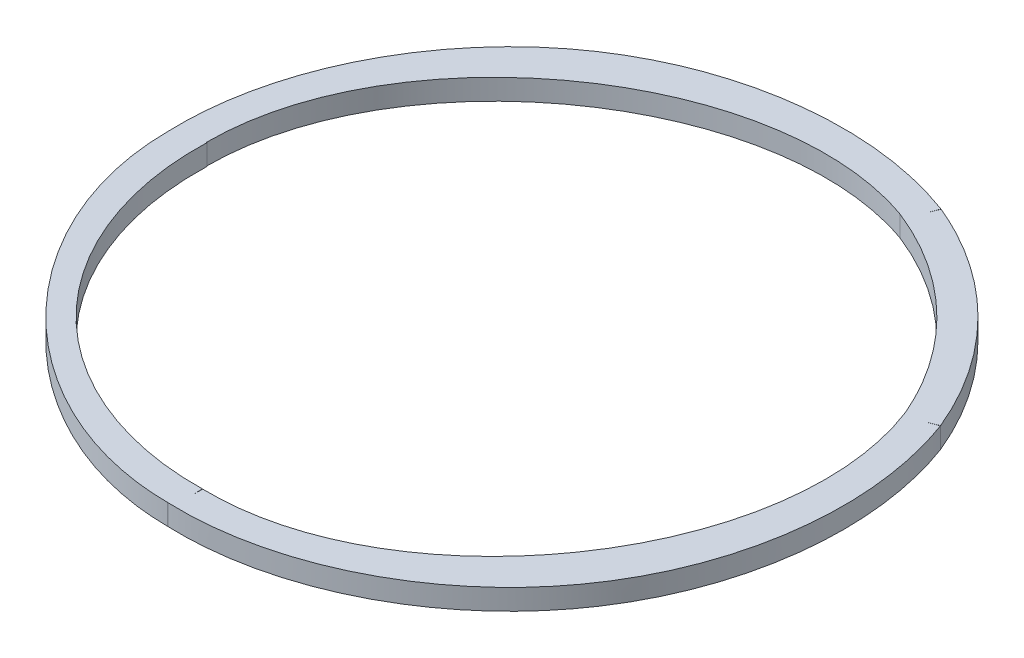
ISO-10303-21;
HEADER;
FILE_DESCRIPTION(('STEP AP214'),'2;1');
FILE_NAME('part.step','',(''),(''),'','','');
FILE_SCHEMA(('AUTOMOTIVE_DESIGN { 1 0 10303 214 1 1 1 1 }'));
ENDSEC;
DATA;
#1=APPLICATION_CONTEXT('core data for automotive mechanical design processes');
#2=APPLICATION_PROTOCOL_DEFINITION('international standard','automotive_design',2000,#1);
#3=PRODUCT_CONTEXT('',#1,'mechanical');
#4=PRODUCT('Part','Part','',(#3));
#5=PRODUCT_RELATED_PRODUCT_CATEGORY('part','',(#4));
#6=PRODUCT_DEFINITION_FORMATION('','',#4);
#7=PRODUCT_DEFINITION_CONTEXT('part definition',#1,'design');
#8=PRODUCT_DEFINITION('design','',#6,#7);
#9=PRODUCT_DEFINITION_SHAPE('','',#8);
#10=(LENGTH_UNIT() NAMED_UNIT(*) SI_UNIT(.MILLI.,.METRE.));
#11=(NAMED_UNIT(*) PLANE_ANGLE_UNIT() SI_UNIT($,.RADIAN.));
#12=(NAMED_UNIT(*) SI_UNIT($,.STERADIAN.) SOLID_ANGLE_UNIT());
#13=UNCERTAINTY_MEASURE_WITH_UNIT(LENGTH_MEASURE(1.E-05),#10,'distance_accuracy_value','');
#14=(GEOMETRIC_REPRESENTATION_CONTEXT(3) GLOBAL_UNCERTAINTY_ASSIGNED_CONTEXT((#13)) GLOBAL_UNIT_ASSIGNED_CONTEXT((#10,
#11,#12)) REPRESENTATION_CONTEXT('',''));
#15=CARTESIAN_POINT('',(0.,0.,0.));
#16=DIRECTION('',(0.,0.,1.));
#17=DIRECTION('',(1.,0.,0.));
#18=AXIS2_PLACEMENT_3D('',#15,#16,#17);
#19=CARTESIAN_POINT('',(131.74613108293,-4.90687617358795,77.1835281712838));
#20=DIRECTION('',(-0.347055812019883,0.,-0.937844477161976));
#21=DIRECTION('',(-0.937844477161976,0.,0.347055812019883));
#22=AXIS2_PLACEMENT_3D('',#19,#20,#21);
#23=PLANE('',#22);
#24=DIRECTION('',(-0.937844477161976,0.,0.347055812019883));
#25=VECTOR('',#24,1.);
#26=CARTESIAN_POINT('',(131.74613108293,-2.98931512157521,77.1835281712838));
#27=LINE('',#26,#25);
#28=CARTESIAN_POINT('',(132.57891060061,-2.98931512157521,76.8753523715857));
#29=VERTEX_POINT('',#28);
#30=CARTESIAN_POINT('',(131.74613108293,-2.98931512157521,77.1835281712839));
#31=VERTEX_POINT('',#30);
#32=EDGE_CURVE('E345',#29,#31,#27,.T.);
#33=ORIENTED_EDGE('',*,*,#32,.F.);
#34=DIRECTION('',(0.,1.,0.));
#35=VECTOR('',#34,1.);
#36=CARTESIAN_POINT('',(132.57891060061,-4.90687617358795,76.8753523715857));
#37=LINE('',#36,#35);
#38=CARTESIAN_POINT('',(132.57891060061,-4.90687617358795,76.8753523715857));
#39=VERTEX_POINT('',#38);
#40=EDGE_CURVE('E37',#39,#29,#37,.T.);
#41=ORIENTED_EDGE('',*,*,#40,.F.);
#42=DIRECTION('',(-0.937844477161976,0.,0.347055812019883));
#43=VECTOR('',#42,1.);
#44=CARTESIAN_POINT('',(131.74613108293,-4.90687617358795,77.1835281712838));
#45=LINE('',#44,#43);
#46=CARTESIAN_POINT('',(131.74613108293,-4.90687617358795,77.1835281712839));
#47=VERTEX_POINT('',#46);
#48=EDGE_CURVE('E444',#39,#47,#45,.T.);
#49=ORIENTED_EDGE('',*,*,#48,.T.);
#50=DIRECTION('',(0.,1.,0.));
#51=VECTOR('',#50,1.);
#52=CARTESIAN_POINT('',(131.74613108293,-4.90687617358795,77.1835281712839));
#53=LINE('',#52,#51);
#54=EDGE_CURVE('E10',#47,#31,#53,.T.);
#55=ORIENTED_EDGE('',*,*,#54,.T.);
#56=EDGE_LOOP('',(#33,#41,#49,#55));
#57=FACE_BOUND('',#56,.T.);
#58=ADVANCED_FACE('F16',(#57),#23,.T.);
#59=CARTESIAN_POINT('',(132.567421969439,-4.90687617358795,76.8459258485361));
#60=DIRECTION('',(0.380194838062493,0.,0.924906419650461));
#61=DIRECTION('',(0.924906419650461,0.,-0.380194838062493));
#62=AXIS2_PLACEMENT_3D('',#59,#60,#61);
#63=PLANE('',#62);
#64=DIRECTION('',(0.924906419650461,0.,-0.380194838062493));
#65=VECTOR('',#64,1.);
#66=CARTESIAN_POINT('',(132.567421969439,-2.98931512157521,76.8459258485361));
#67=LINE('',#66,#65);
#68=CARTESIAN_POINT('',(132.567421969439,-2.98931512157521,76.8459258485361));
#69=VERTEX_POINT('',#68);
#70=EDGE_CURVE('E339',#31,#69,#67,.T.);
#71=ORIENTED_EDGE('',*,*,#70,.F.);
#72=ORIENTED_EDGE('',*,*,#54,.F.);
#73=DIRECTION('',(0.924906419650461,0.,-0.380194838062493));
#74=VECTOR('',#73,1.);
#75=CARTESIAN_POINT('',(132.567421969439,-4.90687617358795,76.8459258485361));
#76=LINE('',#75,#74);
#77=CARTESIAN_POINT('',(132.567421969439,-4.90687617358795,76.8459258485361));
#78=VERTEX_POINT('',#77);
#79=EDGE_CURVE('E505',#47,#78,#76,.T.);
#80=ORIENTED_EDGE('',*,*,#79,.T.);
#81=DIRECTION('',(0.,1.,0.));
#82=VECTOR('',#81,1.);
#83=CARTESIAN_POINT('',(132.567421969439,-4.90687617358795,76.8459258485361));
#84=LINE('',#83,#82);
#85=EDGE_CURVE('E28',#78,#69,#84,.T.);
#86=ORIENTED_EDGE('',*,*,#85,.T.);
#87=EDGE_LOOP('',(#71,#72,#80,#86));
#88=FACE_BOUND('',#87,.T.);
#89=ADVANCED_FACE('F487',(#88),#63,.T.);
#90=CARTESIAN_POINT('',(132.567421969439,-4.90687617358795,76.8459258485361));
#91=CARTESIAN_POINT('',(129.354522332708,-4.90687617358795,69.0298505045138));
#92=CARTESIAN_POINT('',(123.053114773261,-4.90687617358794,62.708370783172));
#93=CARTESIAN_POINT('',(115.246623995575,-4.90687617358796,59.4707913904024));
#94=B_SPLINE_CURVE_WITH_KNOTS('',3,(#90,#91,#92,#93),.UNSPECIFIED.,.F.,.F.,(4,4),(0.,1.),.UNSPECIFIED.);
#95=DIRECTION('',(0.,1.,0.));
#96=VECTOR('',#95,1.);
#97=SURFACE_OF_LINEAR_EXTRUSION('',#94,#96);
#98=CARTESIAN_POINT('',(132.567421969439,-2.98931512157521,76.8459258485361));
#99=CARTESIAN_POINT('',(129.354522332708,-2.98931512157521,69.0298505045138));
#100=CARTESIAN_POINT('',(123.053114773261,-2.9893151215752,62.708370783172));
#101=CARTESIAN_POINT('',(115.246623995575,-2.98931512157521,59.4707913904024));
#102=B_SPLINE_CURVE_WITH_KNOTS('',3,(#98,#99,#100,#101),.UNSPECIFIED.,.F.,.F.,(4,4),(0.,1.),.UNSPECIFIED.);
#103=CARTESIAN_POINT('',(115.246623995575,-2.98931512157521,59.4707913904024));
#104=VERTEX_POINT('',#103);
#105=EDGE_CURVE('E334',#69,#104,#102,.T.);
#106=ORIENTED_EDGE('',*,*,#105,.F.);
#107=ORIENTED_EDGE('',*,*,#85,.F.);
#108=CARTESIAN_POINT('',(115.246623995575,-4.90687617358795,59.4707913904024));
#109=VERTEX_POINT('',#108);
#110=EDGE_CURVE('E508',#78,#109,#94,.T.);
#111=ORIENTED_EDGE('',*,*,#110,.T.);
#112=DIRECTION('',(0.,1.,0.));
#113=VECTOR('',#112,1.);
#114=CARTESIAN_POINT('',(115.246623995575,-4.90687617358795,59.4707913904024));
#115=LINE('',#114,#113);
#116=EDGE_CURVE('E268',#109,#104,#115,.T.);
#117=ORIENTED_EDGE('',*,*,#116,.T.);
#118=EDGE_LOOP('',(#106,#107,#111,#117));
#119=FACE_BOUND('',#118,.T.);
#120=ADVANCED_FACE('F492',(#119),#97,.T.);
#121=CARTESIAN_POINT('',(114.906450926429,-4.90687617358796,60.2910208288004));
#122=DIRECTION('',(-0.923711057340234,0.,-0.383089914442272));
#123=DIRECTION('',(-0.383089914442272,0.,0.923711057340234));
#124=AXIS2_PLACEMENT_3D('',#121,#122,#123);
#125=PLANE('',#124);
#126=DIRECTION('',(-0.383089914442271,0.,0.923711057340234));
#127=VECTOR('',#126,1.);
#128=CARTESIAN_POINT('',(114.906450926429,-2.98931512157521,60.2910208288004));
#129=LINE('',#128,#127);
#130=CARTESIAN_POINT('',(114.906450926429,-2.98931512157521,60.2910208288004));
#131=VERTEX_POINT('',#130);
#132=EDGE_CURVE('E331',#104,#131,#129,.T.);
#133=ORIENTED_EDGE('',*,*,#132,.F.);
#134=ORIENTED_EDGE('',*,*,#116,.F.);
#135=DIRECTION('',(-0.383089914442271,0.,0.923711057340234));
#136=VECTOR('',#135,1.);
#137=CARTESIAN_POINT('',(114.906450926429,-4.90687617358796,60.2910208288004));
#138=LINE('',#137,#136);
#139=CARTESIAN_POINT('',(114.906450926429,-4.90687617358795,60.2910208288004));
#140=VERTEX_POINT('',#139);
#141=EDGE_CURVE('E514',#109,#140,#138,.T.);
#142=ORIENTED_EDGE('',*,*,#141,.T.);
#143=DIRECTION('',(0.,1.,0.));
#144=VECTOR('',#143,1.);
#145=CARTESIAN_POINT('',(114.906450926429,-4.90687617358795,60.2910208288004));
#146=LINE('',#145,#144);
#147=EDGE_CURVE('E270',#140,#131,#146,.T.);
#148=ORIENTED_EDGE('',*,*,#147,.T.);
#149=EDGE_LOOP('',(#133,#134,#142,#148));
#150=FACE_BOUND('',#149,.T.);
#151=ADVANCED_FACE('F521',(#150),#125,.T.);
#152=CARTESIAN_POINT('',(115.217245685027,-4.90687617358796,59.4592151624247));
#153=DIRECTION('',(0.936747763028618,0.,0.350005183477161));
#154=DIRECTION('',(0.350005183477161,0.,-0.936747763028618));
#155=AXIS2_PLACEMENT_3D('',#152,#153,#154);
#156=PLANE('',#155);
#157=DIRECTION('',(0.350005183477161,0.,-0.936747763028617));
#158=VECTOR('',#157,1.);
#159=CARTESIAN_POINT('',(115.217245685027,-2.98931512157521,59.4592151624247));
#160=LINE('',#159,#158);
#161=CARTESIAN_POINT('',(115.217245685027,-2.98931512157521,59.4592151624247));
#162=VERTEX_POINT('',#161);
#163=EDGE_CURVE('E328',#131,#162,#160,.T.);
#164=ORIENTED_EDGE('',*,*,#163,.F.);
#165=ORIENTED_EDGE('',*,*,#147,.F.);
#166=DIRECTION('',(0.350005183477161,0.,-0.936747763028617));
#167=VECTOR('',#166,1.);
#168=CARTESIAN_POINT('',(115.217245685027,-4.90687617358796,59.4592151624247));
#169=LINE('',#168,#167);
#170=CARTESIAN_POINT('',(115.217245685027,-4.90687617358795,59.4592151624247));
#171=VERTEX_POINT('',#170);
#172=EDGE_CURVE('E637',#140,#171,#169,.T.);
#173=ORIENTED_EDGE('',*,*,#172,.T.);
#174=DIRECTION('',(0.,1.,0.));
#175=VECTOR('',#174,1.);
#176=CARTESIAN_POINT('',(115.217245685027,-4.90687617358795,59.4592151624247));
#177=LINE('',#176,#175);
#178=EDGE_CURVE('E272',#171,#162,#177,.T.);
#179=ORIENTED_EDGE('',*,*,#178,.T.);
#180=EDGE_LOOP('',(#164,#165,#173,#179));
#181=FACE_BOUND('',#180,.T.);
#182=ADVANCED_FACE('F525',(#181),#156,.T.);
#183=CARTESIAN_POINT('',(115.217245685027,-4.90687617358796,59.4592151624247));
#184=CARTESIAN_POINT('',(105.681355024891,-4.90687617358796,55.8962377080369));
#185=CARTESIAN_POINT('',(94.5520967245877,-4.90687617358796,57.2719692969751));
#186=CARTESIAN_POINT('',(78.0335164211189,-4.90687617358795,68.7285782238615));
#187=CARTESIAN_POINT('',(72.8340523476976,-4.90687617358795,78.7905740329447));
#188=CARTESIAN_POINT('',(73.1976504384416,-4.90687617358796,88.9851735999077));
#189=B_SPLINE_CURVE_WITH_KNOTS('',3,(#183,#184,#185,#186,#187,#188),.UNSPECIFIED.,.F.,.F.,(4,2,
4),(0.,0.5,1.),.UNSPECIFIED.);
#190=DIRECTION('',(0.,1.,0.));
#191=VECTOR('',#190,1.);
#192=SURFACE_OF_LINEAR_EXTRUSION('',#189,#191);
#193=CARTESIAN_POINT('',(115.217245685027,-2.98931512157521,59.4592151624247));
#194=CARTESIAN_POINT('',(105.681355024891,-2.98931512157522,55.8962377080369));
#195=CARTESIAN_POINT('',(94.5520967245877,-2.98931512157522,57.2719692969751));
#196=CARTESIAN_POINT('',(78.0335164211189,-2.98931512157521,68.7285782238615));
#197=CARTESIAN_POINT('',(72.8340523476976,-2.98931512157521,78.7905740329447));
#198=CARTESIAN_POINT('',(73.1976504384416,-2.98931512157521,88.9851735999077));
#199=B_SPLINE_CURVE_WITH_KNOTS('',3,(#193,#194,#195,#196,#197,#198),.UNSPECIFIED.,.F.,.F.,(4,2,
4),(0.,0.5,1.),.UNSPECIFIED.);
#200=CARTESIAN_POINT('',(73.1967187214954,-2.98931512157521,88.9527180602785));
#201=VERTEX_POINT('',#200);
#202=EDGE_CURVE('E318',#162,#201,#199,.T.);
#203=ORIENTED_EDGE('',*,*,#202,.F.);
#204=ORIENTED_EDGE('',*,*,#178,.F.);
#205=CARTESIAN_POINT('',(73.1967187214954,-4.90687617358796,88.9527180602785));
#206=VERTEX_POINT('',#205);
#207=EDGE_CURVE('E543',#171,#206,#189,.T.);
#208=ORIENTED_EDGE('',*,*,#207,.T.);
#209=CARTESIAN_POINT('',(73.1965119092439,-4.90687617358796,88.9527251971773));
#210=DIRECTION('',(0.,1.,0.));
#211=VECTOR('',#210,1.);
#212=LINE('',#209,#211);
#213=EDGE_CURVE('E274',#206,#201,#212,.T.);
#214=ORIENTED_EDGE('',*,*,#213,.T.);
#215=EDGE_LOOP('',(#203,#204,#208,#214));
#216=FACE_BOUND('',#215,.T.);
#217=ADVANCED_FACE('F528',(#216),#192,.T.);
#218=CARTESIAN_POINT('',(73.1970864928779,-4.90687617358795,88.9528098957694));
#219=DIRECTION('',(-0.99999967705338,0.,-0.000803674770162937));
#220=DIRECTION('',(-0.000803674770162937,0.,0.99999967705338));
#221=AXIS2_PLACEMENT_3D('',#218,#219,#220);
#222=PLANE('',#221);
#223=CARTESIAN_POINT('',(73.1970864928779,-2.98931512157521,88.9528098957694));
#224=CARTESIAN_POINT('',(73.1970740422201,-2.98931512157521,88.9683020503149));
#225=CARTESIAN_POINT('',(73.1970615915623,-2.98931512157521,88.9837942048609));
#226=CARTESIAN_POINT('',(73.1970491409046,-2.98931512157521,88.9992863594075));
#227=B_SPLINE_CURVE_WITH_KNOTS('',3,(#223,#224,#225,#226),.UNSPECIFIED.,.F.,.F.,(4,4),(0.,1.),.UNSPECIFIED.);
#228=CARTESIAN_POINT('',(73.1970735882525,-2.98931512157521,88.9688669149515));
#229=VERTEX_POINT('',#228);
#230=EDGE_CURVE('E311',#201,#229,#227,.T.);
#231=ORIENTED_EDGE('',*,*,#230,.F.);
#232=ORIENTED_EDGE('',*,*,#213,.F.);
#233=CARTESIAN_POINT('',(73.1970864928779,-4.90687617358795,88.9528098957694));
#234=CARTESIAN_POINT('',(73.1970740422201,-4.90687617358795,88.9683020503149));
#235=CARTESIAN_POINT('',(73.1970615915623,-4.90687617358795,88.9837942048609));
#236=CARTESIAN_POINT('',(73.1970491409046,-4.90687617358795,88.9992863594075));
#237=B_SPLINE_CURVE_WITH_KNOTS('',3,(#233,#234,#235,#236),.UNSPECIFIED.,.F.,.F.,(4,4),(0.,1.),.UNSPECIFIED.);
#238=CARTESIAN_POINT('',(73.1970735882525,-4.90687617358795,88.9688669149515));
#239=VERTEX_POINT('',#238);
#240=EDGE_CURVE('E544',#206,#239,#237,.T.);
#241=ORIENTED_EDGE('',*,*,#240,.T.);
#242=CARTESIAN_POINT('',(73.1970735882525,-4.90687617358795,88.9688669149515));
#243=DIRECTION('',(0.,1.,0.));
#244=VECTOR('',#243,1.);
#245=LINE('',#242,#244);
#246=EDGE_CURVE('E570',#239,#229,#245,.T.);
#247=ORIENTED_EDGE('',*,*,#246,.T.);
#248=EDGE_LOOP('',(#231,#232,#241,#247));
#249=FACE_BOUND('',#248,.T.);
#250=ADVANCED_FACE('F534',(#249),#222,.T.);
#251=CARTESIAN_POINT('',(73.1970735882671,-4.90687617358795,88.9688669149514));
#252=DIRECTION('',(-0.999374888732158,0.,0.035352959870252));
#253=DIRECTION('',(0.035352959870252,0.,0.999374888732158));
#254=AXIS2_PLACEMENT_3D('',#251,#252,#253);
#255=PLANE('',#254);
#256=CARTESIAN_POINT('',(73.1970735882671,-2.98931512157521,88.9688669149514));
#257=DIRECTION('',(0.035352959870252,0.,0.999374888732157));
#258=VECTOR('',#257,1.);
#259=LINE('',#256,#258);
#260=CARTESIAN_POINT('',(73.197060483358,-2.98931512157521,88.985173125776));
#261=VERTEX_POINT('',#260);
#262=EDGE_CURVE('E306',#229,#261,#259,.T.);
#263=ORIENTED_EDGE('',*,*,#262,.F.);
#264=ORIENTED_EDGE('',*,*,#246,.F.);
#265=CARTESIAN_POINT('',(73.1970735882671,-4.90687617358795,88.9688669149514));
#266=DIRECTION('',(0.035352959870252,0.,0.999374888732157));
#267=VECTOR('',#266,1.);
#268=LINE('',#265,#267);
#269=CARTESIAN_POINT('',(73.197060483358,-4.90687617358795,88.985173125776));
#270=VERTEX_POINT('',#269);
#271=EDGE_CURVE('E551',#239,#270,#268,.T.);
#272=ORIENTED_EDGE('',*,*,#271,.T.);
#273=CARTESIAN_POINT('',(73.1976496843455,-4.90687617358795,88.9851522827479));
#274=DIRECTION('',(0.,1.,0.));
#275=VECTOR('',#274,1.);
#276=LINE('',#273,#275);
#277=EDGE_CURVE('E567',#270,#261,#276,.T.);
#278=ORIENTED_EDGE('',*,*,#277,.T.);
#279=EDGE_LOOP('',(#263,#264,#272,#278));
#280=FACE_BOUND('',#279,.T.);
#281=ADVANCED_FACE('F566',(#280),#255,.T.);
#282=CARTESIAN_POINT('',(73.197060483358,-4.90687617358795,88.9851731257762));
#283=DIRECTION('',(-0.999999677053379,0.,-0.00080367477147785));
#284=DIRECTION('',(-0.000803674771477851,0.,0.999999677053379));
#285=AXIS2_PLACEMENT_3D('',#282,#283,#284);
#286=PLANE('',#285);
#287=CARTESIAN_POINT('',(73.1970483730414,-2.98931512157521,89.0000000003412));
#288=VERTEX_POINT('',#287);
#289=EDGE_CURVE('E303',#261,#288,#227,.T.);
#290=ORIENTED_EDGE('',*,*,#289,.F.);
#291=ORIENTED_EDGE('',*,*,#277,.F.);
#292=CARTESIAN_POINT('',(73.1970483730414,-4.90687617358795,89.0000000003412));
#293=VERTEX_POINT('',#292);
#294=EDGE_CURVE('E192',#270,#293,#237,.T.);
#295=ORIENTED_EDGE('',*,*,#294,.T.);
#296=CARTESIAN_POINT('',(73.1970483730414,-2.98931512157521,89.0000000003411));
#297=DIRECTION('',(0.,-1.,0.));
#298=VECTOR('',#297,1.);
#299=LINE('',#296,#298);
#300=EDGE_CURVE('E182',#293,#288,#299,.F.);
#301=ORIENTED_EDGE('',*,*,#300,.T.);
#302=EDGE_LOOP('',(#290,#291,#295,#301));
#303=FACE_BOUND('',#302,.T.);
#304=ADVANCED_FACE('F588',(#303),#286,.T.);
#305=CARTESIAN_POINT('',(73.1970465787081,-4.90687617358795,88.9981731985335));
#306=CARTESIAN_POINT('',(73.2113156432783,-4.90687617358777,104.124024311091));
#307=CARTESIAN_POINT('',(87.8298454791401,-4.90687617358795,118.749451335204));
#308=CARTESIAN_POINT('',(102.955714428733,-4.90687617358795,118.802927714868));
#309=B_SPLINE_CURVE_WITH_KNOTS('',3,(#305,#306,#307,#308),.UNSPECIFIED.,.F.,.F.,(4,4),(0.,
1.00018311291933),.UNSPECIFIED.);
#310=DIRECTION('',(0.,1.,0.));
#311=VECTOR('',#310,1.);
#312=SURFACE_OF_LINEAR_EXTRUSION('',#309,#311);
#313=CARTESIAN_POINT('',(73.1970465787081,-2.98931512157521,88.9981731985335));
#314=CARTESIAN_POINT('',(73.2113156432783,-2.98931512157503,104.124024311091));
#315=CARTESIAN_POINT('',(87.8298454791401,-2.98931512157521,118.749451335204));
#316=CARTESIAN_POINT('',(102.955714428733,-2.98931512157521,118.802927714868));
#317=B_SPLINE_CURVE_WITH_KNOTS('',3,(#313,#314,#315,#316),.UNSPECIFIED.,.F.,.F.,(4,4),(0.,
1.00018311291933),.UNSPECIFIED.);
#318=CARTESIAN_POINT('',(102.91982184636,-2.98931512157521,118.802773470941));
#319=VERTEX_POINT('',#318);
#320=EDGE_CURVE('E294',#288,#319,#317,.T.);
#321=ORIENTED_EDGE('',*,*,#320,.F.);
#322=ORIENTED_EDGE('',*,*,#300,.F.);
#323=CARTESIAN_POINT('',(102.91982184636,-4.90687617358795,118.802773470941));
#324=VERTEX_POINT('',#323);
#325=EDGE_CURVE('E186',#293,#324,#309,.T.);
#326=ORIENTED_EDGE('',*,*,#325,.T.);
#327=CARTESIAN_POINT('',(102.919821846362,-4.90687617358795,118.802773470941));
#328=DIRECTION('',(0.,1.,0.));
#329=VECTOR('',#328,1.);
#330=LINE('',#327,#329);
#331=EDGE_CURVE('E169',#324,#319,#330,.T.);
#332=ORIENTED_EDGE('',*,*,#331,.T.);
#333=EDGE_LOOP('',(#321,#322,#326,#332));
#334=FACE_BOUND('',#333,.T.);
#335=ADVANCED_FACE('F187',(#334),#312,.T.);
#336=CARTESIAN_POINT('',(102.919824372808,-4.90687617358795,118.802274091416));
#337=DIRECTION('',(-0.0379512822219053,0.,0.999279590594001));
#338=DIRECTION('',(0.999279590594001,0.,0.0379512822219053));
#339=AXIS2_PLACEMENT_3D('',#336,#337,#338);
#340=PLANE('',#339);
#341=CARTESIAN_POINT('',(102.919824372808,-2.98931512157521,118.802274091416));
#342=CARTESIAN_POINT('',(102.937076562523,-2.98931512157521,118.802929306159));
#343=CARTESIAN_POINT('',(102.954328752239,-2.98931512157521,118.803584520903));
#344=CARTESIAN_POINT('',(102.971580941954,-2.98931512157521,118.804239735647));
#345=B_SPLINE_CURVE_WITH_KNOTS('',3,(#341,#342,#343,#344),.UNSPECIFIED.,.F.,.F.,(4,4),(0.,1.),.UNSPECIFIED.);
#346=CARTESIAN_POINT('',(102.971980983345,-2.98931512157521,118.804254748068));
#347=VERTEX_POINT('',#346);
#348=EDGE_CURVE('E177',#319,#347,#345,.T.);
#349=ORIENTED_EDGE('',*,*,#348,.F.);
#350=ORIENTED_EDGE('',*,*,#331,.F.);
#351=CARTESIAN_POINT('',(102.919824372808,-4.90687617358795,118.802274091416));
#352=CARTESIAN_POINT('',(102.937076562523,-4.90687617358795,118.802929306159));
#353=CARTESIAN_POINT('',(102.954328752239,-4.90687617358795,118.803584520903));
#354=CARTESIAN_POINT('',(102.971580941954,-4.90687617358795,118.804239735647));
#355=B_SPLINE_CURVE_WITH_KNOTS('',3,(#351,#352,#353,#354),.UNSPECIFIED.,.F.,.F.,(4,4),(0.,1.),.UNSPECIFIED.);
#356=CARTESIAN_POINT('',(102.971980983345,-4.90687617358795,118.804254748068));
#357=VERTEX_POINT('',#356);
#358=EDGE_CURVE('E174',#324,#357,#355,.T.);
#359=ORIENTED_EDGE('',*,*,#358,.T.);
#360=CARTESIAN_POINT('',(102.971980976658,-2.98931512157521,118.804254928422));
#361=DIRECTION('',(0.,-1.,0.));
#362=VECTOR('',#361,1.);
#363=LINE('',#360,#362);
#364=EDGE_CURVE('E104',#357,#347,#363,.F.);
#365=ORIENTED_EDGE('',*,*,#364,.T.);
#366=EDGE_LOOP('',(#349,#350,#359,#365));
#367=FACE_BOUND('',#366,.T.);
#368=ADVANCED_FACE('F172',(#367),#340,.T.);
#369=CARTESIAN_POINT('',(103.479883290933,-4.90687617358795,116.995887412745));
#370=DIRECTION('',(-0.999769118438514,0.,-0.0214874339249061));
#371=DIRECTION('',(-0.0214874339249061,0.,0.999769118438514));
#372=AXIS2_PLACEMENT_3D('',#369,#370,#371);
#373=PLANE('',#372);
#374=DIRECTION('',(-0.0214874339249061,0.,0.999769118438514));
#375=VECTOR('',#374,1.);
#376=CARTESIAN_POINT('',(103.479883290933,-2.98931512157521,116.995887412745));
#377=LINE('',#376,#375);
#378=CARTESIAN_POINT('',(103.498963527898,-2.98931512157521,116.108120555319));
#379=VERTEX_POINT('',#378);
#380=CARTESIAN_POINT('',(103.479883290933,-2.98931512157521,116.995887412745));
#381=VERTEX_POINT('',#380);
#382=EDGE_CURVE('E387',#379,#381,#377,.T.);
#383=ORIENTED_EDGE('',*,*,#382,.F.);
#384=DIRECTION('',(0.,1.,0.));
#385=VECTOR('',#384,1.);
#386=CARTESIAN_POINT('',(103.498963527898,-4.90687617358795,116.108120555319));
#387=LINE('',#386,#385);
#388=CARTESIAN_POINT('',(103.498963527898,-4.90687617358795,116.108120555319));
#389=VERTEX_POINT('',#388);
#390=EDGE_CURVE('E198',#389,#379,#387,.T.);
#391=ORIENTED_EDGE('',*,*,#390,.F.);
#392=DIRECTION('',(-0.0214874339249061,0.,0.999769118438514));
#393=VECTOR('',#392,1.);
#394=CARTESIAN_POINT('',(103.479883290933,-4.90687617358795,116.995887412745));
#395=LINE('',#394,#393);
#396=CARTESIAN_POINT('',(103.479883290933,-4.90687617358795,116.995887412745));
#397=VERTEX_POINT('',#396);
#398=EDGE_CURVE('E285',#389,#397,#395,.T.);
#399=ORIENTED_EDGE('',*,*,#398,.T.);
#400=DIRECTION('',(0.,1.,0.));
#401=VECTOR('',#400,1.);
#402=CARTESIAN_POINT('',(103.479883290933,-4.90687617358795,116.995887412745));
#403=LINE('',#402,#401);
#404=EDGE_CURVE('E116',#397,#381,#403,.T.);
#405=ORIENTED_EDGE('',*,*,#404,.T.);
#406=EDGE_LOOP('',(#383,#391,#399,#405));
#407=FACE_BOUND('',#406,.T.);
#408=ADVANCED_FACE('F18',(#407),#373,.T.);
#409=CARTESIAN_POINT('',(103.479883290933,-4.90687617358795,116.995887412745));
#410=DIRECTION('',(0.999853121883743,0.,-0.0171386889619107));
#411=DIRECTION('',(-0.0171386889619107,0.,-0.999853121883743));
#412=AXIS2_PLACEMENT_3D('',#409,#410,#411);
#413=PLANE('',#412);
#414=DIRECTION('',(-0.0171386889619107,0.,-0.999853121883743));
#415=VECTOR('',#414,1.);
#416=CARTESIAN_POINT('',(103.479883290933,-2.98931512157521,116.995887412745));
#417=LINE('',#416,#415);
#418=CARTESIAN_POINT('',(103.464664617182,-2.98931512157521,116.108045962622));
#419=VERTEX_POINT('',#418);
#420=EDGE_CURVE('E384',#381,#419,#417,.T.);
#421=ORIENTED_EDGE('',*,*,#420,.F.);
#422=ORIENTED_EDGE('',*,*,#404,.F.);
#423=DIRECTION('',(-0.0171386889619107,0.,-0.999853121883743));
#424=VECTOR('',#423,1.);
#425=CARTESIAN_POINT('',(103.479883290933,-4.90687617358795,116.995887412745));
#426=LINE('',#425,#424);
#427=CARTESIAN_POINT('',(103.464664617182,-4.90687617358795,116.108045962622));
#428=VERTEX_POINT('',#427);
#429=EDGE_CURVE('E406',#397,#428,#426,.T.);
#430=ORIENTED_EDGE('',*,*,#429,.T.);
#431=DIRECTION('',(0.,1.,0.));
#432=VECTOR('',#431,1.);
#433=CARTESIAN_POINT('',(103.464664617182,-4.90687617358795,116.108045962622));
#434=LINE('',#433,#432);
#435=EDGE_CURVE('E252',#428,#419,#434,.T.);
#436=ORIENTED_EDGE('',*,*,#435,.T.);
#437=EDGE_LOOP('',(#421,#422,#430,#436));
#438=FACE_BOUND('',#437,.T.);
#439=ADVANCED_FACE('F404',(#438),#413,.T.);
#440=CARTESIAN_POINT('',(103.,-4.90687617358796,89.));
#441=DIRECTION('',(0.,1.,0.));
#442=DIRECTION('',(0.,0.,1.));
#443=AXIS2_PLACEMENT_3D('',#440,#441,#442);
#444=CYLINDRICAL_SURFACE('',#443,27.1120281262414);
#445=CARTESIAN_POINT('',(103.,-2.98931512157521,89.));
#446=DIRECTION('',(0.,-1.,0.));
#447=DIRECTION('',(0.0171386889619051,0.,0.999853121883743));
#448=AXIS2_PLACEMENT_3D('',#445,#446,#447);
#449=CIRCLE('',#448,27.1120281262414);
#450=CARTESIAN_POINT('',(75.9030142949208,-2.98931512157521,88.0969857050793));
#451=VERTEX_POINT('',#450);
#452=EDGE_CURVE('E381',#419,#451,#449,.T.);
#453=ORIENTED_EDGE('',*,*,#452,.F.);
#454=ORIENTED_EDGE('',*,*,#435,.F.);
#455=CARTESIAN_POINT('',(103.,-4.90687617358796,89.));
#456=DIRECTION('',(0.,-1.,0.));
#457=DIRECTION('',(0.0171386889619051,0.,0.999853121883743));
#458=AXIS2_PLACEMENT_3D('',#455,#456,#457);
#459=CIRCLE('',#458,27.1120281262414);
#460=CARTESIAN_POINT('',(75.9030142949208,-4.90687617358795,88.0969857050793));
#461=VERTEX_POINT('',#460);
#462=EDGE_CURVE('E447',#428,#461,#459,.T.);
#463=ORIENTED_EDGE('',*,*,#462,.T.);
#464=DIRECTION('',(0.,1.,0.));
#465=VECTOR('',#464,1.);
#466=CARTESIAN_POINT('',(75.9030142949208,-4.90687617358795,88.0969857050793));
#467=LINE('',#466,#465);
#468=EDGE_CURVE('E254',#461,#451,#467,.T.);
#469=ORIENTED_EDGE('',*,*,#468,.T.);
#470=EDGE_LOOP('',(#453,#454,#463,#469));
#471=FACE_BOUND('',#470,.T.);
#472=ADVANCED_FACE('F410',(#471),#444,.F.);
#473=CARTESIAN_POINT('',(75.9030142949208,-4.90687617358796,88.0969857050793));
#474=DIRECTION('',(-0.707106781186547,0.,-0.707106781186547));
#475=DIRECTION('',(-0.707106781186548,0.,0.707106781186548));
#476=AXIS2_PLACEMENT_3D('',#473,#474,#475);
#477=PLANE('',#476);
#478=DIRECTION('',(-0.707106781186548,0.,0.707106781186548));
#479=VECTOR('',#478,1.);
#480=CARTESIAN_POINT('',(75.9030142949208,-2.98931512157521,88.0969857050793));
#481=LINE('',#480,#479);
#482=CARTESIAN_POINT('',(75.8879718737587,-2.98931512157521,88.1120281262414));
#483=VERTEX_POINT('',#482);
#484=EDGE_CURVE('E378',#451,#483,#481,.T.);
#485=ORIENTED_EDGE('',*,*,#484,.F.);
#486=ORIENTED_EDGE('',*,*,#468,.F.);
#487=DIRECTION('',(-0.707106781186548,0.,0.707106781186548));
#488=VECTOR('',#487,1.);
#489=CARTESIAN_POINT('',(75.9030142949208,-4.90687617358796,88.0969857050793));
#490=LINE('',#489,#488);
#491=CARTESIAN_POINT('',(75.8879718737587,-4.90687617358795,88.1120281262414));
#492=VERTEX_POINT('',#491);
#493=EDGE_CURVE('E417',#461,#492,#490,.T.);
#494=ORIENTED_EDGE('',*,*,#493,.T.);
#495=DIRECTION('',(0.,1.,0.));
#496=VECTOR('',#495,1.);
#497=CARTESIAN_POINT('',(75.8879718737587,-4.90687617358795,88.1120281262414));
#498=LINE('',#497,#496);
#499=EDGE_CURVE('E256',#492,#483,#498,.T.);
#500=ORIENTED_EDGE('',*,*,#499,.T.);
#501=EDGE_LOOP('',(#485,#486,#494,#500));
#502=FACE_BOUND('',#501,.T.);
#503=ADVANCED_FACE('F414',(#502),#477,.T.);
#504=CARTESIAN_POINT('',(75.8879718737587,-4.90687617358795,88.1120281262414));
#505=DIRECTION('',(0.,0.,-1.));
#506=DIRECTION('',(-1.,0.,0.));
#507=AXIS2_PLACEMENT_3D('',#504,#505,#506);
#508=PLANE('',#507);
#509=DIRECTION('',(-1.,0.,0.));
#510=VECTOR('',#509,1.);
#511=CARTESIAN_POINT('',(75.8879718737587,-2.98931512157521,88.1120281262414));
#512=LINE('',#511,#510);
#513=CARTESIAN_POINT('',(75.8359775714973,-2.98931512157521,88.1120281262414));
#514=VERTEX_POINT('',#513);
#515=EDGE_CURVE('E375',#483,#514,#512,.T.);
#516=ORIENTED_EDGE('',*,*,#515,.F.);
#517=ORIENTED_EDGE('',*,*,#499,.F.);
#518=DIRECTION('',(-1.,0.,0.));
#519=VECTOR('',#518,1.);
#520=CARTESIAN_POINT('',(75.8879718737587,-4.90687617358795,88.1120281262414));
#521=LINE('',#520,#519);
#522=CARTESIAN_POINT('',(75.8359775714973,-4.90687617358795,88.1120281262414));
#523=VERTEX_POINT('',#522);
#524=EDGE_CURVE('E423',#492,#523,#521,.T.);
#525=ORIENTED_EDGE('',*,*,#524,.T.);
#526=DIRECTION('',(0.,1.,0.));
#527=VECTOR('',#526,1.);
#528=CARTESIAN_POINT('',(75.8359775714973,-4.90687617358795,88.1120281262414));
#529=LINE('',#528,#527);
#530=EDGE_CURVE('E258',#523,#514,#529,.T.);
#531=ORIENTED_EDGE('',*,*,#530,.T.);
#532=EDGE_LOOP('',(#516,#517,#525,#531));
#533=FACE_BOUND('',#532,.T.);
#534=ADVANCED_FACE('F421',(#533),#508,.T.);
#535=CARTESIAN_POINT('',(75.8515006231099,-4.90687617358795,88.095896720617));
#536=DIRECTION('',(0.72056331672551,0.,0.693389145133909));
#537=DIRECTION('',(0.693389145133909,0.,-0.72056331672551));
#538=AXIS2_PLACEMENT_3D('',#535,#536,#537);
#539=PLANE('',#538);
#540=DIRECTION('',(0.693389145133909,0.,-0.72056331672551));
#541=VECTOR('',#540,1.);
#542=CARTESIAN_POINT('',(75.8515006231099,-2.98931512157521,88.095896720617));
#543=LINE('',#542,#541);
#544=CARTESIAN_POINT('',(75.8515006231099,-2.98931512157521,88.095896720617));
#545=VERTEX_POINT('',#544);
#546=EDGE_CURVE('E369',#514,#545,#543,.T.);
#547=ORIENTED_EDGE('',*,*,#546,.F.);
#548=ORIENTED_EDGE('',*,*,#530,.F.);
#549=DIRECTION('',(0.693389145133909,0.,-0.72056331672551));
#550=VECTOR('',#549,1.);
#551=CARTESIAN_POINT('',(75.8515006231099,-4.90687617358795,88.095896720617));
#552=LINE('',#551,#550);
#553=CARTESIAN_POINT('',(75.8515006231099,-4.90687617358795,88.095896720617));
#554=VERTEX_POINT('',#553);
#555=EDGE_CURVE('E457',#523,#554,#552,.T.);
#556=ORIENTED_EDGE('',*,*,#555,.T.);
#557=DIRECTION('',(0.,1.,0.));
#558=VECTOR('',#557,1.);
#559=CARTESIAN_POINT('',(75.8515006231099,-4.90687617358795,88.095896720617));
#560=LINE('',#559,#558);
#561=EDGE_CURVE('E260',#554,#545,#560,.T.);
#562=ORIENTED_EDGE('',*,*,#561,.T.);
#563=EDGE_LOOP('',(#547,#548,#556,#562));
#564=FACE_BOUND('',#563,.T.);
#565=ADVANCED_FACE('F427',(#564),#539,.T.);
#566=CARTESIAN_POINT('',(75.8688094114098,-4.90687617358795,88.9658814684064));
#567=CARTESIAN_POINT('',(75.1601391478144,-4.90687617358791,70.5355871309559));
#568=CARTESIAN_POINT('',(96.3256815149182,-4.90687617358796,55.640196003306));
#569=CARTESIAN_POINT('',(113.750052397024,-4.90687617358796,61.7672883254106));
#570=B_SPLINE_CURVE_WITH_KNOTS('',3,(#566,#567,#568,#569),.UNSPECIFIED.,.F.,.F.,(4,4),(0.,1.),.UNSPECIFIED.);
#571=DIRECTION('',(0.,1.,0.));
#572=VECTOR('',#571,1.);
#573=SURFACE_OF_LINEAR_EXTRUSION('',#570,#572);
#574=CARTESIAN_POINT('',(75.8688094114098,-2.98931512157521,88.9658814684064));
#575=CARTESIAN_POINT('',(75.1601391478144,-2.98931512157517,70.5355871309559));
#576=CARTESIAN_POINT('',(96.3256815149182,-2.98931512157521,55.640196003306));
#577=CARTESIAN_POINT('',(113.750052397024,-2.98931512157521,61.7672883254106));
#578=B_SPLINE_CURVE_WITH_KNOTS('',3,(#574,#575,#576,#577),.UNSPECIFIED.,.F.,.F.,(4,4),(0.,1.),.UNSPECIFIED.);
#579=CARTESIAN_POINT('',(113.734688426444,-2.98931512157521,61.7618915382885));
#580=VERTEX_POINT('',#579);
#581=EDGE_CURVE('E361',#545,#580,#578,.T.);
#582=ORIENTED_EDGE('',*,*,#581,.F.);
#583=ORIENTED_EDGE('',*,*,#561,.F.);
#584=CARTESIAN_POINT('',(113.734688426444,-4.90687617358795,61.7618915382885));
#585=VERTEX_POINT('',#584);
#586=EDGE_CURVE('E434',#554,#585,#570,.T.);
#587=ORIENTED_EDGE('',*,*,#586,.T.);
#588=DIRECTION('',(0.,1.,0.));
#589=VECTOR('',#588,1.);
#590=CARTESIAN_POINT('',(113.734688426444,-4.90687617358795,61.7618915382885));
#591=LINE('',#590,#589);
#592=EDGE_CURVE('E262',#585,#580,#591,.T.);
#593=ORIENTED_EDGE('',*,*,#592,.T.);
#594=EDGE_LOOP('',(#582,#583,#587,#593));
#595=FACE_BOUND('',#594,.T.);
#596=ADVANCED_FACE('F431',(#595),#573,.T.);
#597=CARTESIAN_POINT('',(113.719495819948,-4.90687617358795,61.7559088340711));
#598=CARTESIAN_POINT('',(120.920837175592,-4.90687617358794,64.5893580429178));
#599=CARTESIAN_POINT('',(126.79707878655,-4.90687617358796,70.2718519728183));
#600=CARTESIAN_POINT('',(129.870135816481,-4.90687617358795,77.3748593429936));
#601=B_SPLINE_CURVE_WITH_KNOTS('',3,(#597,#598,#599,#600),.UNSPECIFIED.,.F.,.F.,(4,4),(0.,1.),.UNSPECIFIED.);
#602=DIRECTION('',(0.,1.,0.));
#603=VECTOR('',#602,1.);
#604=SURFACE_OF_LINEAR_EXTRUSION('',#601,#603);
#605=CARTESIAN_POINT('',(113.719495819948,-2.98931512157521,61.7559088340711));
#606=CARTESIAN_POINT('',(120.920837175592,-2.9893151215752,64.5893580429178));
#607=CARTESIAN_POINT('',(126.79707878655,-2.98931512157522,70.2718519728183));
#608=CARTESIAN_POINT('',(129.870135816481,-2.98931512157521,77.3748593429936));
#609=B_SPLINE_CURVE_WITH_KNOTS('',3,(#605,#606,#607,#608),.UNSPECIFIED.,.F.,.F.,(4,4),(0.,1.),.UNSPECIFIED.);
#610=CARTESIAN_POINT('',(129.863676301065,-2.98931512157521,77.3599405567637));
#611=VERTEX_POINT('',#610);
#612=EDGE_CURVE('E353',#580,#611,#609,.T.);
#613=ORIENTED_EDGE('',*,*,#612,.F.);
#614=ORIENTED_EDGE('',*,*,#592,.F.);
#615=CARTESIAN_POINT('',(129.863676301065,-4.90687617358795,77.3599405567637));
#616=VERTEX_POINT('',#615);
#617=EDGE_CURVE('E439',#585,#616,#601,.T.);
#618=ORIENTED_EDGE('',*,*,#617,.T.);
#619=DIRECTION('',(0.,1.,0.));
#620=VECTOR('',#619,1.);
#621=CARTESIAN_POINT('',(129.863676301065,-4.90687617358795,77.3599405567637));
#622=LINE('',#621,#620);
#623=EDGE_CURVE('E264',#616,#611,#622,.T.);
#624=ORIENTED_EDGE('',*,*,#623,.T.);
#625=EDGE_LOOP('',(#613,#614,#618,#624));
#626=FACE_BOUND('',#625,.T.);
#627=ADVANCED_FACE('F438',(#626),#604,.T.);
#628=CARTESIAN_POINT('',(129.85779178828,-4.90687617358795,77.3448329892497));
#629=CARTESIAN_POINT('',(136.624290112617,-4.90687617358794,94.6996090782285));
#630=CARTESIAN_POINT('',(122.097903471732,-4.90687617358792,116.507856340058));
#631=CARTESIAN_POINT('',(103.498963527898,-4.90687617358795,116.108120555319));
#632=B_SPLINE_CURVE_WITH_KNOTS('',3,(#628,#629,#630,#631),.UNSPECIFIED.,.F.,.F.,(4,4),(0.,1.),.UNSPECIFIED.);
#633=DIRECTION('',(0.,1.,0.));
#634=VECTOR('',#633,1.);
#635=SURFACE_OF_LINEAR_EXTRUSION('',#632,#634);
#636=CARTESIAN_POINT('',(129.85779178828,-2.98931512157521,77.3448329892497));
#637=CARTESIAN_POINT('',(136.624290112617,-2.9893151215752,94.6996090782285));
#638=CARTESIAN_POINT('',(122.097903471732,-2.98931512157518,116.507856340058));
#639=CARTESIAN_POINT('',(103.498963527898,-2.98931512157521,116.108120555319));
#640=B_SPLINE_CURVE_WITH_KNOTS('',3,(#636,#637,#638,#639),.UNSPECIFIED.,.F.,.F.,(4,4),(0.,1.),.UNSPECIFIED.);
#641=EDGE_CURVE('E348',#611,#379,#640,.T.);
#642=ORIENTED_EDGE('',*,*,#641,.F.);
#643=ORIENTED_EDGE('',*,*,#623,.F.);
#644=EDGE_CURVE('E442',#616,#389,#632,.T.);
#645=ORIENTED_EDGE('',*,*,#644,.T.);
#646=ORIENTED_EDGE('',*,*,#390,.T.);
#647=EDGE_LOOP('',(#642,#643,#645,#646));
#648=FACE_BOUND('',#647,.T.);
#649=ADVANCED_FACE('F228',(#648),#635,.T.);
#650=CARTESIAN_POINT('',(102.360918419485,-4.90687617358795,118.781599346826));
#651=CARTESIAN_POINT('',(102.564739287902,-4.90687617358795,118.789156151381));
#652=CARTESIAN_POINT('',(102.768560156319,-4.90687617358795,118.796712955936));
#653=CARTESIAN_POINT('',(102.972381024735,-4.90687617358795,118.80426976049));
#654=CARTESIAN_POINT('',(113.163424445573,-4.90687617358795,119.182109988225));
#655=CARTESIAN_POINT('',(123.195682830234,-4.90687617358795,114.030058912522));
#656=CARTESIAN_POINT('',(134.70733610472,-4.90687617358796,97.5350606510732));
#657=CARTESIAN_POINT('',(136.110073474907,-4.90687617358795,86.4175685942288));
#658=CARTESIAN_POINT('',(132.57891060061,-4.90687617358795,76.8753523715857));
#659=B_SPLINE_CURVE_WITH_KNOTS('',3,(#650,#651,#652,#653,#654,#655,#656,#657,#658),
.UNSPECIFIED.,.F.,.F.,(4,3,2,4),(-0.01,0.,0.5,1.),.UNSPECIFIED.);
#660=DIRECTION('',(0.,1.,0.));
#661=VECTOR('',#660,1.);
#662=SURFACE_OF_LINEAR_EXTRUSION('',#659,#661);
#663=CARTESIAN_POINT('',(102.972381024735,-2.98931512157521,118.80426976049));
#664=CARTESIAN_POINT('',(113.163424445573,-2.98931512157521,119.182109988225));
#665=CARTESIAN_POINT('',(123.195682830234,-2.98931512157521,114.030058912522));
#666=CARTESIAN_POINT('',(134.70733610472,-2.98931512157522,97.5350606510732));
#667=CARTESIAN_POINT('',(136.110073474907,-2.98931512157521,86.4175685942288));
#668=CARTESIAN_POINT('',(132.57891060061,-2.98931512157521,76.8753523715857));
#669=B_SPLINE_CURVE_WITH_KNOTS('',3,(#663,#664,#665,#666,#667,#668),.UNSPECIFIED.,.F.,.F.,(4,2,
4),(0.,0.5,1.),.UNSPECIFIED.);
#670=EDGE_CURVE('E280',#347,#29,#669,.T.);
#671=ORIENTED_EDGE('',*,*,#670,.F.);
#672=ORIENTED_EDGE('',*,*,#364,.F.);
#673=EDGE_CURVE('E196',#357,#39,#659,.T.);
#674=ORIENTED_EDGE('',*,*,#673,.T.);
#675=ORIENTED_EDGE('',*,*,#40,.T.);
#676=EDGE_LOOP('',(#671,#672,#674,#675));
#677=FACE_BOUND('',#676,.T.);
#678=ADVANCED_FACE('F223',(#677),#662,.T.);
#679=CARTESIAN_POINT('',(91.9905859982235,-4.90687617358795,115.737030383871));
#680=DIRECTION('',(0.,1.,0.));
#681=DIRECTION('',(-1.,0.,0.));
#682=AXIS2_PLACEMENT_3D('',#679,#680,#681);
#683=PLANE('',#682);
#684=ORIENTED_EDGE('',*,*,#398,.F.);
#685=ORIENTED_EDGE('',*,*,#644,.F.);
#686=ORIENTED_EDGE('',*,*,#617,.F.);
#687=ORIENTED_EDGE('',*,*,#586,.F.);
#688=ORIENTED_EDGE('',*,*,#555,.F.);
#689=ORIENTED_EDGE('',*,*,#524,.F.);
#690=ORIENTED_EDGE('',*,*,#493,.F.);
#691=ORIENTED_EDGE('',*,*,#462,.F.);
#692=ORIENTED_EDGE('',*,*,#429,.F.);
#693=EDGE_LOOP('',(#684,#685,#686,#687,#688,#689,#690,#691,#692));
#694=FACE_BOUND('',#693,.T.);
#695=ORIENTED_EDGE('',*,*,#48,.F.);
#696=ORIENTED_EDGE('',*,*,#673,.F.);
#697=ORIENTED_EDGE('',*,*,#358,.F.);
#698=ORIENTED_EDGE('',*,*,#325,.F.);
#699=ORIENTED_EDGE('',*,*,#294,.F.);
#700=ORIENTED_EDGE('',*,*,#271,.F.);
#701=ORIENTED_EDGE('',*,*,#240,.F.);
#702=ORIENTED_EDGE('',*,*,#207,.F.);
#703=ORIENTED_EDGE('',*,*,#172,.F.);
#704=ORIENTED_EDGE('',*,*,#141,.F.);
#705=ORIENTED_EDGE('',*,*,#110,.F.);
#706=ORIENTED_EDGE('',*,*,#79,.F.);
#707=EDGE_LOOP('',(#695,#696,#697,#698,#699,#700,#701,#702,#703,#704,#705,#706));
#708=FACE_BOUND('',#707,.T.);
#709=ADVANCED_FACE('F195',(#694,#708),#683,.F.);
#710=CARTESIAN_POINT('',(91.9905859982235,-2.98931512157521,115.737030383871));
#711=DIRECTION('',(0.,1.,0.));
#712=DIRECTION('',(-1.,0.,0.));
#713=AXIS2_PLACEMENT_3D('',#710,#711,#712);
#714=PLANE('',#713);
#715=ORIENTED_EDGE('',*,*,#382,.T.);
#716=ORIENTED_EDGE('',*,*,#420,.T.);
#717=ORIENTED_EDGE('',*,*,#452,.T.);
#718=ORIENTED_EDGE('',*,*,#484,.T.);
#719=ORIENTED_EDGE('',*,*,#515,.T.);
#720=ORIENTED_EDGE('',*,*,#546,.T.);
#721=ORIENTED_EDGE('',*,*,#581,.T.);
#722=ORIENTED_EDGE('',*,*,#612,.T.);
#723=ORIENTED_EDGE('',*,*,#641,.T.);
#724=EDGE_LOOP('',(#715,#716,#717,#718,#719,#720,#721,#722,#723));
#725=FACE_BOUND('',#724,.T.);
#726=ORIENTED_EDGE('',*,*,#32,.T.);
#727=ORIENTED_EDGE('',*,*,#70,.T.);
#728=ORIENTED_EDGE('',*,*,#105,.T.);
#729=ORIENTED_EDGE('',*,*,#132,.T.);
#730=ORIENTED_EDGE('',*,*,#163,.T.);
#731=ORIENTED_EDGE('',*,*,#202,.T.);
#732=ORIENTED_EDGE('',*,*,#230,.T.);
#733=ORIENTED_EDGE('',*,*,#262,.T.);
#734=ORIENTED_EDGE('',*,*,#289,.T.);
#735=ORIENTED_EDGE('',*,*,#320,.T.);
#736=ORIENTED_EDGE('',*,*,#348,.T.);
#737=ORIENTED_EDGE('',*,*,#670,.T.);
#738=EDGE_LOOP('',(#726,#727,#728,#729,#730,#731,#732,#733,#734,#735,#736,#737));
#739=FACE_BOUND('',#738,.T.);
#740=ADVANCED_FACE('F229',(#725,#739),#714,.T.);
#741=CLOSED_SHELL('',(#58,#89,#120,#151,#182,#217,#250,#281,#304,#335,#368,#408,#439,#472,#503,
#534,#565,#596,#627,#649,#678,#709,#740));
#742=MANIFOLD_SOLID_BREP('B1',#741);
#743=ADVANCED_BREP_SHAPE_REPRESENTATION('',(#18,#742),#14);
#744=SHAPE_DEFINITION_REPRESENTATION(#9,#743);
ENDSEC;
END-ISO-10303-21;
